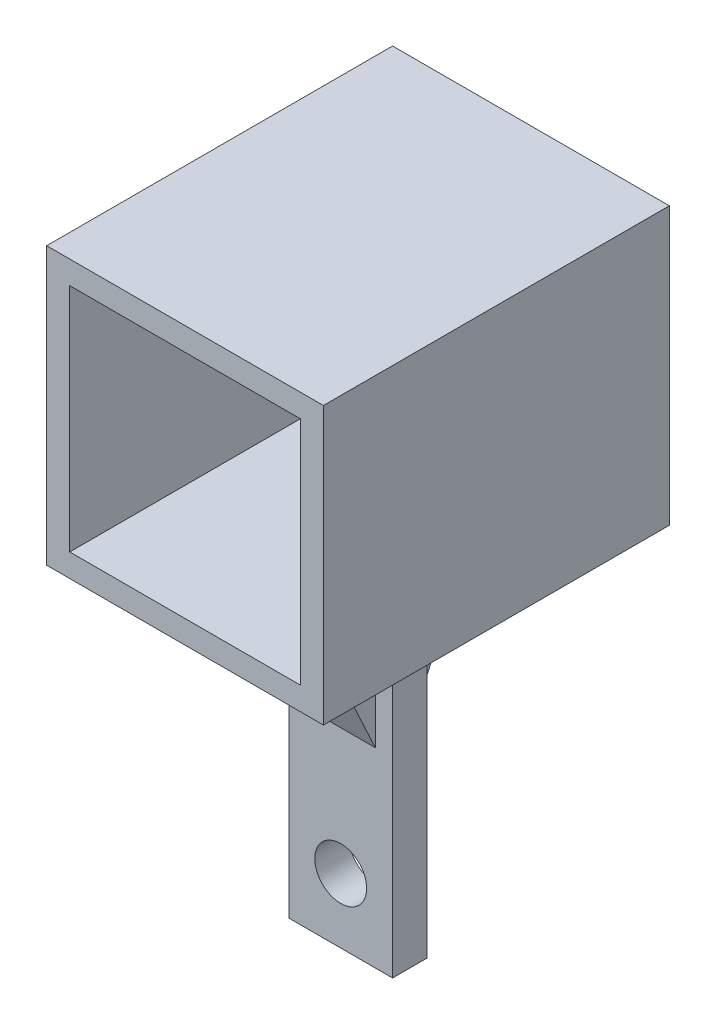
ISO-10303-21;
HEADER;
FILE_DESCRIPTION(('STEP AP214'),'2;1');
FILE_NAME('part.step','',(''),(''),'','','');
FILE_SCHEMA(('AUTOMOTIVE_DESIGN { 1 0 10303 214 1 1 1 1 }'));
ENDSEC;
DATA;
#1=APPLICATION_CONTEXT('core data for automotive mechanical design processes');
#2=APPLICATION_PROTOCOL_DEFINITION('international standard','automotive_design',2000,#1);
#3=PRODUCT_CONTEXT('',#1,'mechanical');
#4=PRODUCT('Part','Part','',(#3));
#5=PRODUCT_RELATED_PRODUCT_CATEGORY('part','',(#4));
#6=PRODUCT_DEFINITION_FORMATION('','',#4);
#7=PRODUCT_DEFINITION_CONTEXT('part definition',#1,'design');
#8=PRODUCT_DEFINITION('design','',#6,#7);
#9=PRODUCT_DEFINITION_SHAPE('','',#8);
#10=(LENGTH_UNIT() NAMED_UNIT(*) SI_UNIT(.MILLI.,.METRE.));
#11=(NAMED_UNIT(*) PLANE_ANGLE_UNIT() SI_UNIT($,.RADIAN.));
#12=(NAMED_UNIT(*) SI_UNIT($,.STERADIAN.) SOLID_ANGLE_UNIT());
#13=UNCERTAINTY_MEASURE_WITH_UNIT(LENGTH_MEASURE(1.E-05),#10,'distance_accuracy_value','');
#14=(GEOMETRIC_REPRESENTATION_CONTEXT(3) GLOBAL_UNCERTAINTY_ASSIGNED_CONTEXT((#13)) GLOBAL_UNIT_ASSIGNED_CONTEXT((#10,
#11,#12)) REPRESENTATION_CONTEXT('',''));
#15=CARTESIAN_POINT('',(0.,0.,0.));
#16=DIRECTION('',(0.,0.,1.));
#17=DIRECTION('',(1.,0.,0.));
#18=AXIS2_PLACEMENT_3D('',#15,#16,#17);
#19=CARTESIAN_POINT('',(0.,0.,1.5));
#20=DIRECTION('',(0.,0.,-1.));
#21=DIRECTION('',(-1.,0.,0.));
#22=AXIS2_PLACEMENT_3D('',#19,#20,#21);
#23=PLANE('',#22);
#24=CARTESIAN_POINT('',(0.,0.,1.5));
#25=DIRECTION('',(0.,0.,1.));
#26=DIRECTION('',(1.,0.,0.));
#27=AXIS2_PLACEMENT_3D('',#24,#25,#26);
#28=CIRCLE('',#27,2.25);
#29=CARTESIAN_POINT('',(2.25,0.,1.5));
#30=VERTEX_POINT('',#29);
#31=EDGE_CURVE('E270',#30,#30,#28,.T.);
#32=ORIENTED_EDGE('',*,*,#31,.F.);
#33=EDGE_LOOP('',(#32));
#34=FACE_BOUND('',#33,.T.);
#35=DIRECTION('',(0.,1.,0.));
#36=VECTOR('',#35,1.);
#37=CARTESIAN_POINT('',(3.,10.95,1.5));
#38=LINE('',#37,#36);
#39=CARTESIAN_POINT('',(3.,10.95,1.5));
#40=VERTEX_POINT('',#39);
#41=CARTESIAN_POINT('',(3.,23.9,1.5));
#42=VERTEX_POINT('',#41);
#43=EDGE_CURVE('E163',#40,#42,#38,.T.);
#44=ORIENTED_EDGE('',*,*,#43,.F.);
#45=DIRECTION('',(-1.,0.,0.));
#46=VECTOR('',#45,1.);
#47=CARTESIAN_POINT('',(3.,10.95,1.5));
#48=LINE('',#47,#46);
#49=CARTESIAN_POINT('',(-3.,10.95,1.5));
#50=VERTEX_POINT('',#49);
#51=EDGE_CURVE('E160',#40,#50,#48,.T.);
#52=ORIENTED_EDGE('',*,*,#51,.T.);
#53=DIRECTION('',(0.,1.,0.));
#54=VECTOR('',#53,1.);
#55=CARTESIAN_POINT('',(-3.,10.95,1.5));
#56=LINE('',#55,#54);
#57=CARTESIAN_POINT('',(-3.,23.9,1.5));
#58=VERTEX_POINT('',#57);
#59=EDGE_CURVE('E170',#50,#58,#56,.T.);
#60=ORIENTED_EDGE('',*,*,#59,.T.);
#61=DIRECTION('',(1.,0.,0.));
#62=VECTOR('',#61,1.);
#63=CARTESIAN_POINT('',(0.,23.9,1.5));
#64=LINE('',#63,#62);
#65=CARTESIAN_POINT('',(-4.5,23.9,1.5));
#66=VERTEX_POINT('',#65);
#67=EDGE_CURVE('E264',#66,#58,#64,.T.);
#68=ORIENTED_EDGE('',*,*,#67,.F.);
#69=DIRECTION('',(0.,-1.,0.));
#70=VECTOR('',#69,1.);
#71=CARTESIAN_POINT('',(-4.5,-5.6,1.5));
#72=LINE('',#71,#70);
#73=CARTESIAN_POINT('',(-4.5,-5.6,1.5));
#74=VERTEX_POINT('',#73);
#75=EDGE_CURVE('E276',#66,#74,#72,.T.);
#76=ORIENTED_EDGE('',*,*,#75,.T.);
#77=DIRECTION('',(1.,0.,0.));
#78=VECTOR('',#77,1.);
#79=CARTESIAN_POINT('',(-4.5,-5.6,1.5));
#80=LINE('',#79,#78);
#81=CARTESIAN_POINT('',(4.5,-5.6,1.5));
#82=VERTEX_POINT('',#81);
#83=EDGE_CURVE('E278',#74,#82,#80,.T.);
#84=ORIENTED_EDGE('',*,*,#83,.T.);
#85=DIRECTION('',(0.,1.,0.));
#86=VECTOR('',#85,1.);
#87=CARTESIAN_POINT('',(4.5,-5.6,1.5));
#88=LINE('',#87,#86);
#89=CARTESIAN_POINT('',(4.5,23.9,1.5));
#90=VERTEX_POINT('',#89);
#91=EDGE_CURVE('E281',#82,#90,#88,.T.);
#92=ORIENTED_EDGE('',*,*,#91,.T.);
#93=EDGE_CURVE('E263',#42,#90,#64,.T.);
#94=ORIENTED_EDGE('',*,*,#93,.F.);
#95=EDGE_LOOP('',(#44,#52,#60,#68,#76,#84,#92,#94));
#96=FACE_BOUND('',#95,.T.);
#97=ADVANCED_FACE('F33',(#34,#96),#23,.F.);
#98=CARTESIAN_POINT('',(-12.,23.9,15.));
#99=DIRECTION('',(0.,1.,0.));
#100=DIRECTION('',(0.,0.,1.));
#101=AXIS2_PLACEMENT_3D('',#98,#99,#100);
#102=PLANE('',#101);
#103=DIRECTION('',(1.,0.,0.));
#104=VECTOR('',#103,1.);
#105=CARTESIAN_POINT('',(-12.,23.9,-15.));
#106=LINE('',#105,#104);
#107=CARTESIAN_POINT('',(-12.,23.9,-15.));
#108=VERTEX_POINT('',#107);
#109=CARTESIAN_POINT('',(12.,23.9,-15.));
#110=VERTEX_POINT('',#109);
#111=EDGE_CURVE('E234',#108,#110,#106,.T.);
#112=ORIENTED_EDGE('',*,*,#111,.T.);
#113=DIRECTION('',(0.,0.,-1.));
#114=VECTOR('',#113,1.);
#115=CARTESIAN_POINT('',(12.,23.9,15.));
#116=LINE('',#115,#114);
#117=CARTESIAN_POINT('',(12.,23.9,15.));
#118=VERTEX_POINT('',#117);
#119=EDGE_CURVE('E240',#118,#110,#116,.T.);
#120=ORIENTED_EDGE('',*,*,#119,.F.);
#121=DIRECTION('',(1.,0.,0.));
#122=VECTOR('',#121,1.);
#123=CARTESIAN_POINT('',(-12.,23.9,15.));
#124=LINE('',#123,#122);
#125=CARTESIAN_POINT('',(-12.,23.9,15.));
#126=VERTEX_POINT('',#125);
#127=EDGE_CURVE('E238',#126,#118,#124,.T.);
#128=ORIENTED_EDGE('',*,*,#127,.F.);
#129=DIRECTION('',(0.,0.,-1.));
#130=VECTOR('',#129,1.);
#131=CARTESIAN_POINT('',(-12.,23.9,15.));
#132=LINE('',#131,#130);
#133=EDGE_CURVE('E250',#126,#108,#132,.T.);
#134=ORIENTED_EDGE('',*,*,#133,.T.);
#135=EDGE_LOOP('',(#112,#120,#128,#134));
#136=FACE_BOUND('',#135,.T.);
#137=DIRECTION('',(0.,0.,1.));
#138=VECTOR('',#137,1.);
#139=CARTESIAN_POINT('',(3.,23.9,1.5));
#140=LINE('',#139,#138);
#141=CARTESIAN_POINT('',(3.,23.9,7.5));
#142=VERTEX_POINT('',#141);
#143=EDGE_CURVE('E164',#42,#142,#140,.T.);
#144=ORIENTED_EDGE('',*,*,#143,.F.);
#145=ORIENTED_EDGE('',*,*,#93,.T.);
#146=DIRECTION('',(0.,0.,-1.));
#147=VECTOR('',#146,1.);
#148=CARTESIAN_POINT('',(4.5,23.9,1.5));
#149=LINE('',#148,#147);
#150=CARTESIAN_POINT('',(4.5,23.9,-1.5));
#151=VERTEX_POINT('',#150);
#152=EDGE_CURVE('E11',#90,#151,#149,.T.);
#153=ORIENTED_EDGE('',*,*,#152,.T.);
#154=DIRECTION('',(1.,0.,0.));
#155=VECTOR('',#154,1.);
#156=CARTESIAN_POINT('',(0.,23.9,-1.5));
#157=LINE('',#156,#155);
#158=CARTESIAN_POINT('',(3.,23.9,-1.5));
#159=VERTEX_POINT('',#158);
#160=EDGE_CURVE('E259',#159,#151,#157,.T.);
#161=ORIENTED_EDGE('',*,*,#160,.F.);
#162=DIRECTION('',(0.,0.,1.));
#163=VECTOR('',#162,1.);
#164=CARTESIAN_POINT('',(3.,23.9,-1.5));
#165=LINE('',#164,#163);
#166=CARTESIAN_POINT('',(3.,23.9,-7.5));
#167=VERTEX_POINT('',#166);
#168=EDGE_CURVE('E183',#167,#159,#165,.T.);
#169=ORIENTED_EDGE('',*,*,#168,.F.);
#170=DIRECTION('',(-1.,0.,0.));
#171=VECTOR('',#170,1.);
#172=CARTESIAN_POINT('',(3.,23.9,-7.5));
#173=LINE('',#172,#171);
#174=CARTESIAN_POINT('',(-3.,23.9,-7.5));
#175=VERTEX_POINT('',#174);
#176=EDGE_CURVE('E191',#167,#175,#173,.T.);
#177=ORIENTED_EDGE('',*,*,#176,.T.);
#178=DIRECTION('',(0.,0.,1.));
#179=VECTOR('',#178,1.);
#180=CARTESIAN_POINT('',(-3.,23.9,-1.5));
#181=LINE('',#180,#179);
#182=CARTESIAN_POINT('',(-3.,23.9,-1.5));
#183=VERTEX_POINT('',#182);
#184=EDGE_CURVE('E176',#175,#183,#181,.T.);
#185=ORIENTED_EDGE('',*,*,#184,.T.);
#186=CARTESIAN_POINT('',(-4.5,23.9,-1.5));
#187=VERTEX_POINT('',#186);
#188=EDGE_CURVE('E260',#187,#183,#157,.T.);
#189=ORIENTED_EDGE('',*,*,#188,.F.);
#190=DIRECTION('',(0.,0.,1.));
#191=VECTOR('',#190,1.);
#192=CARTESIAN_POINT('',(-4.5,23.9,1.5));
#193=LINE('',#192,#191);
#194=EDGE_CURVE('E266',#187,#66,#193,.T.);
#195=ORIENTED_EDGE('',*,*,#194,.T.);
#196=ORIENTED_EDGE('',*,*,#67,.T.);
#197=DIRECTION('',(0.,0.,1.));
#198=VECTOR('',#197,1.);
#199=CARTESIAN_POINT('',(-3.,23.9,1.5));
#200=LINE('',#199,#198);
#201=CARTESIAN_POINT('',(-3.,23.9,7.5));
#202=VERTEX_POINT('',#201);
#203=EDGE_CURVE('E175',#58,#202,#200,.T.);
#204=ORIENTED_EDGE('',*,*,#203,.T.);
#205=DIRECTION('',(-1.,0.,0.));
#206=VECTOR('',#205,1.);
#207=CARTESIAN_POINT('',(3.,23.9,7.5));
#208=LINE('',#207,#206);
#209=EDGE_CURVE('E48',#142,#202,#208,.T.);
#210=ORIENTED_EDGE('',*,*,#209,.F.);
#211=EDGE_LOOP('',(#144,#145,#153,#161,#169,#177,#185,#189,#195,#196,#204,#210));
#212=FACE_BOUND('',#211,.T.);
#213=ADVANCED_FACE('F173',(#136,#212),#102,.F.);
#214=CARTESIAN_POINT('',(0.,0.,-1.5));
#215=DIRECTION('',(0.,0.,-1.));
#216=DIRECTION('',(-1.,0.,0.));
#217=AXIS2_PLACEMENT_3D('',#214,#215,#216);
#218=PLANE('',#217);
#219=DIRECTION('',(0.,-1.,0.));
#220=VECTOR('',#219,1.);
#221=CARTESIAN_POINT('',(3.,10.95,-1.5));
#222=LINE('',#221,#220);
#223=CARTESIAN_POINT('',(3.,10.95,-1.5));
#224=VERTEX_POINT('',#223);
#225=EDGE_CURVE('E186',#159,#224,#222,.T.);
#226=ORIENTED_EDGE('',*,*,#225,.F.);
#227=ORIENTED_EDGE('',*,*,#160,.T.);
#228=DIRECTION('',(0.,1.,0.));
#229=VECTOR('',#228,1.);
#230=CARTESIAN_POINT('',(4.5,-5.6,-1.5));
#231=LINE('',#230,#229);
#232=CARTESIAN_POINT('',(4.5,-5.6,-1.5));
#233=VERTEX_POINT('',#232);
#234=EDGE_CURVE('E279',#233,#151,#231,.T.);
#235=ORIENTED_EDGE('',*,*,#234,.F.);
#236=DIRECTION('',(1.,0.,0.));
#237=VECTOR('',#236,1.);
#238=CARTESIAN_POINT('',(-4.5,-5.6,-1.5));
#239=LINE('',#238,#237);
#240=CARTESIAN_POINT('',(-4.5,-5.6,-1.5));
#241=VERTEX_POINT('',#240);
#242=EDGE_CURVE('E286',#241,#233,#239,.T.);
#243=ORIENTED_EDGE('',*,*,#242,.F.);
#244=DIRECTION('',(0.,-1.,0.));
#245=VECTOR('',#244,1.);
#246=CARTESIAN_POINT('',(-4.5,-5.6,-1.5));
#247=LINE('',#246,#245);
#248=EDGE_CURVE('E273',#187,#241,#247,.T.);
#249=ORIENTED_EDGE('',*,*,#248,.F.);
#250=ORIENTED_EDGE('',*,*,#188,.T.);
#251=DIRECTION('',(0.,-1.,0.));
#252=VECTOR('',#251,1.);
#253=CARTESIAN_POINT('',(-3.,10.95,-1.5));
#254=LINE('',#253,#252);
#255=CARTESIAN_POINT('',(-3.,10.95,-1.5));
#256=VERTEX_POINT('',#255);
#257=EDGE_CURVE('E178',#183,#256,#254,.T.);
#258=ORIENTED_EDGE('',*,*,#257,.T.);
#259=DIRECTION('',(-1.,0.,0.));
#260=VECTOR('',#259,1.);
#261=CARTESIAN_POINT('',(3.,10.95,-1.5));
#262=LINE('',#261,#260);
#263=EDGE_CURVE('E56',#224,#256,#262,.T.);
#264=ORIENTED_EDGE('',*,*,#263,.F.);
#265=EDGE_LOOP('',(#226,#227,#235,#243,#249,#250,#258,#264));
#266=FACE_BOUND('',#265,.T.);
#267=CARTESIAN_POINT('',(0.,0.,-1.5));
#268=DIRECTION('',(0.,0.,1.));
#269=DIRECTION('',(1.,0.,0.));
#270=AXIS2_PLACEMENT_3D('',#267,#268,#269);
#271=CIRCLE('',#270,2.25);
#272=CARTESIAN_POINT('',(2.25,0.,-1.5));
#273=VERTEX_POINT('',#272);
#274=EDGE_CURVE('E269',#273,#273,#271,.T.);
#275=ORIENTED_EDGE('',*,*,#274,.T.);
#276=EDGE_LOOP('',(#275));
#277=FACE_BOUND('',#276,.T.);
#278=ADVANCED_FACE('F303',(#266,#277),#218,.T.);
#279=CARTESIAN_POINT('',(-4.5,-5.6,1.5));
#280=DIRECTION('',(1.,0.,0.));
#281=DIRECTION('',(0.,0.,-1.));
#282=AXIS2_PLACEMENT_3D('',#279,#280,#281);
#283=PLANE('',#282);
#284=ORIENTED_EDGE('',*,*,#194,.F.);
#285=ORIENTED_EDGE('',*,*,#248,.T.);
#286=DIRECTION('',(0.,0.,-1.));
#287=VECTOR('',#286,1.);
#288=CARTESIAN_POINT('',(-4.5,-5.6,1.5));
#289=LINE('',#288,#287);
#290=EDGE_CURVE('E41',#74,#241,#289,.T.);
#291=ORIENTED_EDGE('',*,*,#290,.F.);
#292=ORIENTED_EDGE('',*,*,#75,.F.);
#293=EDGE_LOOP('',(#284,#285,#291,#292));
#294=FACE_BOUND('',#293,.T.);
#295=ADVANCED_FACE('F35',(#294),#283,.F.);
#296=CARTESIAN_POINT('',(4.5,-5.6,1.5));
#297=DIRECTION('',(-1.,0.,0.));
#298=DIRECTION('',(0.,-1.,0.));
#299=AXIS2_PLACEMENT_3D('',#296,#297,#298);
#300=PLANE('',#299);
#301=ORIENTED_EDGE('',*,*,#152,.F.);
#302=ORIENTED_EDGE('',*,*,#91,.F.);
#303=DIRECTION('',(0.,0.,-1.));
#304=VECTOR('',#303,1.);
#305=CARTESIAN_POINT('',(4.5,-5.6,1.5));
#306=LINE('',#305,#304);
#307=EDGE_CURVE('E284',#82,#233,#306,.T.);
#308=ORIENTED_EDGE('',*,*,#307,.T.);
#309=ORIENTED_EDGE('',*,*,#234,.T.);
#310=EDGE_LOOP('',(#301,#302,#308,#309));
#311=FACE_BOUND('',#310,.T.);
#312=ADVANCED_FACE('F308',(#311),#300,.F.);
#313=CARTESIAN_POINT('',(-4.5,-5.6,1.5));
#314=DIRECTION('',(0.,1.,0.));
#315=DIRECTION('',(0.,0.,1.));
#316=AXIS2_PLACEMENT_3D('',#313,#314,#315);
#317=PLANE('',#316);
#318=ORIENTED_EDGE('',*,*,#242,.T.);
#319=ORIENTED_EDGE('',*,*,#307,.F.);
#320=ORIENTED_EDGE('',*,*,#83,.F.);
#321=ORIENTED_EDGE('',*,*,#290,.T.);
#322=EDGE_LOOP('',(#318,#319,#320,#321));
#323=FACE_BOUND('',#322,.T.);
#324=ADVANCED_FACE('F295',(#323),#317,.F.);
#325=CARTESIAN_POINT('',(0.,0.,1.5));
#326=DIRECTION('',(0.,0.,-1.));
#327=DIRECTION('',(-1.,0.,0.));
#328=AXIS2_PLACEMENT_3D('',#325,#326,#327);
#329=CYLINDRICAL_SURFACE('',#328,2.25);
#330=ORIENTED_EDGE('',*,*,#31,.T.);
#331=EDGE_LOOP('',(#330));
#332=FACE_BOUND('',#331,.T.);
#333=ORIENTED_EDGE('',*,*,#274,.F.);
#334=EDGE_LOOP('',(#333));
#335=FACE_BOUND('',#334,.T.);
#336=ADVANCED_FACE('F345',(#332,#335),#329,.F.);
#337=CARTESIAN_POINT('',(0.,0.,15.));
#338=DIRECTION('',(0.,0.,-1.));
#339=DIRECTION('',(-1.,0.,0.));
#340=AXIS2_PLACEMENT_3D('',#337,#338,#339);
#341=PLANE('',#340);
#342=DIRECTION('',(0.,1.,0.));
#343=VECTOR('',#342,1.);
#344=CARTESIAN_POINT('',(12.,23.9,15.));
#345=LINE('',#344,#343);
#346=CARTESIAN_POINT('',(12.,47.9,15.));
#347=VERTEX_POINT('',#346);
#348=EDGE_CURVE('E230',#118,#347,#345,.T.);
#349=ORIENTED_EDGE('',*,*,#348,.T.);
#350=DIRECTION('',(-1.,0.,0.));
#351=VECTOR('',#350,1.);
#352=CARTESIAN_POINT('',(-12.,47.9,15.));
#353=LINE('',#352,#351);
#354=CARTESIAN_POINT('',(-12.,47.9,15.));
#355=VERTEX_POINT('',#354);
#356=EDGE_CURVE('E233',#347,#355,#353,.T.);
#357=ORIENTED_EDGE('',*,*,#356,.T.);
#358=DIRECTION('',(0.,-1.,0.));
#359=VECTOR('',#358,1.);
#360=CARTESIAN_POINT('',(-12.,23.9,15.));
#361=LINE('',#360,#359);
#362=EDGE_CURVE('E236',#355,#126,#361,.T.);
#363=ORIENTED_EDGE('',*,*,#362,.T.);
#364=ORIENTED_EDGE('',*,*,#127,.T.);
#365=EDGE_LOOP('',(#349,#357,#363,#364));
#366=FACE_BOUND('',#365,.T.);
#367=DIRECTION('',(0.,1.,0.));
#368=VECTOR('',#367,1.);
#369=CARTESIAN_POINT('',(10.,25.9,15.));
#370=LINE('',#369,#368);
#371=CARTESIAN_POINT('',(10.,25.9,15.));
#372=VERTEX_POINT('',#371);
#373=CARTESIAN_POINT('',(10.,45.9,15.));
#374=VERTEX_POINT('',#373);
#375=EDGE_CURVE('E199',#372,#374,#370,.T.);
#376=ORIENTED_EDGE('',*,*,#375,.F.);
#377=DIRECTION('',(1.,0.,0.));
#378=VECTOR('',#377,1.);
#379=CARTESIAN_POINT('',(-10.,25.9,15.));
#380=LINE('',#379,#378);
#381=CARTESIAN_POINT('',(-10.,25.9,15.));
#382=VERTEX_POINT('',#381);
#383=EDGE_CURVE('E207',#382,#372,#380,.T.);
#384=ORIENTED_EDGE('',*,*,#383,.F.);
#385=DIRECTION('',(0.,-1.,0.));
#386=VECTOR('',#385,1.);
#387=CARTESIAN_POINT('',(-10.,25.9,15.));
#388=LINE('',#387,#386);
#389=CARTESIAN_POINT('',(-10.,45.9,15.));
#390=VERTEX_POINT('',#389);
#391=EDGE_CURVE('E204',#390,#382,#388,.T.);
#392=ORIENTED_EDGE('',*,*,#391,.F.);
#393=DIRECTION('',(-1.,0.,0.));
#394=VECTOR('',#393,1.);
#395=CARTESIAN_POINT('',(-10.,45.9,15.));
#396=LINE('',#395,#394);
#397=EDGE_CURVE('E201',#374,#390,#396,.T.);
#398=ORIENTED_EDGE('',*,*,#397,.F.);
#399=EDGE_LOOP('',(#376,#384,#392,#398));
#400=FACE_BOUND('',#399,.T.);
#401=ADVANCED_FACE('F358',(#366,#400),#341,.F.);
#402=CARTESIAN_POINT('',(0.,0.,-15.));
#403=DIRECTION('',(0.,0.,-1.));
#404=DIRECTION('',(-1.,0.,0.));
#405=AXIS2_PLACEMENT_3D('',#402,#403,#404);
#406=PLANE('',#405);
#407=DIRECTION('',(0.,1.,0.));
#408=VECTOR('',#407,1.);
#409=CARTESIAN_POINT('',(12.,23.9,-15.));
#410=LINE('',#409,#408);
#411=CARTESIAN_POINT('',(12.,47.9,-15.));
#412=VERTEX_POINT('',#411);
#413=EDGE_CURVE('E229',#110,#412,#410,.T.);
#414=ORIENTED_EDGE('',*,*,#413,.F.);
#415=ORIENTED_EDGE('',*,*,#111,.F.);
#416=DIRECTION('',(0.,-1.,0.));
#417=VECTOR('',#416,1.);
#418=CARTESIAN_POINT('',(-12.,23.9,-15.));
#419=LINE('',#418,#417);
#420=CARTESIAN_POINT('',(-12.,47.9,-15.));
#421=VERTEX_POINT('',#420);
#422=EDGE_CURVE('E245',#421,#108,#419,.T.);
#423=ORIENTED_EDGE('',*,*,#422,.F.);
#424=DIRECTION('',(-1.,0.,0.));
#425=VECTOR('',#424,1.);
#426=CARTESIAN_POINT('',(-12.,47.9,-15.));
#427=LINE('',#426,#425);
#428=EDGE_CURVE('E243',#412,#421,#427,.T.);
#429=ORIENTED_EDGE('',*,*,#428,.F.);
#430=EDGE_LOOP('',(#414,#415,#423,#429));
#431=FACE_BOUND('',#430,.T.);
#432=DIRECTION('',(1.,0.,0.));
#433=VECTOR('',#432,1.);
#434=CARTESIAN_POINT('',(-10.,25.9,-15.));
#435=LINE('',#434,#433);
#436=CARTESIAN_POINT('',(-10.,25.9,-15.));
#437=VERTEX_POINT('',#436);
#438=CARTESIAN_POINT('',(10.,25.9,-15.));
#439=VERTEX_POINT('',#438);
#440=EDGE_CURVE('E202',#437,#439,#435,.T.);
#441=ORIENTED_EDGE('',*,*,#440,.T.);
#442=DIRECTION('',(0.,1.,0.));
#443=VECTOR('',#442,1.);
#444=CARTESIAN_POINT('',(10.,25.9,-15.));
#445=LINE('',#444,#443);
#446=CARTESIAN_POINT('',(10.,45.9,-15.));
#447=VERTEX_POINT('',#446);
#448=EDGE_CURVE('E198',#439,#447,#445,.T.);
#449=ORIENTED_EDGE('',*,*,#448,.T.);
#450=DIRECTION('',(-1.,0.,0.));
#451=VECTOR('',#450,1.);
#452=CARTESIAN_POINT('',(-10.,45.9,-15.));
#453=LINE('',#452,#451);
#454=CARTESIAN_POINT('',(-10.,45.9,-15.));
#455=VERTEX_POINT('',#454);
#456=EDGE_CURVE('E212',#447,#455,#453,.T.);
#457=ORIENTED_EDGE('',*,*,#456,.T.);
#458=DIRECTION('',(0.,-1.,0.));
#459=VECTOR('',#458,1.);
#460=CARTESIAN_POINT('',(-10.,25.9,-15.));
#461=LINE('',#460,#459);
#462=EDGE_CURVE('E215',#455,#437,#461,.T.);
#463=ORIENTED_EDGE('',*,*,#462,.T.);
#464=EDGE_LOOP('',(#441,#449,#457,#463));
#465=FACE_BOUND('',#464,.T.);
#466=ADVANCED_FACE('F363',(#431,#465),#406,.T.);
#467=CARTESIAN_POINT('',(12.,23.9,15.));
#468=DIRECTION('',(-1.,0.,0.));
#469=DIRECTION('',(0.,0.,1.));
#470=AXIS2_PLACEMENT_3D('',#467,#468,#469);
#471=PLANE('',#470);
#472=ORIENTED_EDGE('',*,*,#413,.T.);
#473=DIRECTION('',(0.,0.,-1.));
#474=VECTOR('',#473,1.);
#475=CARTESIAN_POINT('',(12.,47.9,15.));
#476=LINE('',#475,#474);
#477=EDGE_CURVE('E256',#347,#412,#476,.T.);
#478=ORIENTED_EDGE('',*,*,#477,.F.);
#479=ORIENTED_EDGE('',*,*,#348,.F.);
#480=ORIENTED_EDGE('',*,*,#119,.T.);
#481=EDGE_LOOP('',(#472,#478,#479,#480));
#482=FACE_BOUND('',#481,.T.);
#483=ADVANCED_FACE('F371',(#482),#471,.F.);
#484=CARTESIAN_POINT('',(-12.,47.9,15.));
#485=DIRECTION('',(0.,-1.,0.));
#486=DIRECTION('',(0.,0.,-1.));
#487=AXIS2_PLACEMENT_3D('',#484,#485,#486);
#488=PLANE('',#487);
#489=ORIENTED_EDGE('',*,*,#428,.T.);
#490=DIRECTION('',(0.,0.,-1.));
#491=VECTOR('',#490,1.);
#492=CARTESIAN_POINT('',(-12.,47.9,15.));
#493=LINE('',#492,#491);
#494=EDGE_CURVE('E253',#355,#421,#493,.T.);
#495=ORIENTED_EDGE('',*,*,#494,.F.);
#496=ORIENTED_EDGE('',*,*,#356,.F.);
#497=ORIENTED_EDGE('',*,*,#477,.T.);
#498=EDGE_LOOP('',(#489,#495,#496,#497));
#499=FACE_BOUND('',#498,.T.);
#500=ADVANCED_FACE('F382',(#499),#488,.F.);
#501=CARTESIAN_POINT('',(-12.,23.9,15.));
#502=DIRECTION('',(1.,0.,0.));
#503=DIRECTION('',(0.,0.,-1.));
#504=AXIS2_PLACEMENT_3D('',#501,#502,#503);
#505=PLANE('',#504);
#506=ORIENTED_EDGE('',*,*,#422,.T.);
#507=ORIENTED_EDGE('',*,*,#133,.F.);
#508=ORIENTED_EDGE('',*,*,#362,.F.);
#509=ORIENTED_EDGE('',*,*,#494,.T.);
#510=EDGE_LOOP('',(#506,#507,#508,#509));
#511=FACE_BOUND('',#510,.T.);
#512=ADVANCED_FACE('F379',(#511),#505,.F.);
#513=CARTESIAN_POINT('',(10.,25.9,15.));
#514=DIRECTION('',(-1.,0.,0.));
#515=DIRECTION('',(0.,0.,1.));
#516=AXIS2_PLACEMENT_3D('',#513,#514,#515);
#517=PLANE('',#516);
#518=ORIENTED_EDGE('',*,*,#448,.F.);
#519=DIRECTION('',(0.,0.,-1.));
#520=VECTOR('',#519,1.);
#521=CARTESIAN_POINT('',(10.,25.9,15.));
#522=LINE('',#521,#520);
#523=EDGE_CURVE('E209',#372,#439,#522,.T.);
#524=ORIENTED_EDGE('',*,*,#523,.F.);
#525=ORIENTED_EDGE('',*,*,#375,.T.);
#526=DIRECTION('',(0.,0.,-1.));
#527=VECTOR('',#526,1.);
#528=CARTESIAN_POINT('',(10.,45.9,15.));
#529=LINE('',#528,#527);
#530=EDGE_CURVE('E226',#374,#447,#529,.T.);
#531=ORIENTED_EDGE('',*,*,#530,.T.);
#532=EDGE_LOOP('',(#518,#524,#525,#531));
#533=FACE_BOUND('',#532,.T.);
#534=ADVANCED_FACE('F376',(#533),#517,.T.);
#535=CARTESIAN_POINT('',(-10.,45.9,15.));
#536=DIRECTION('',(0.,-1.,0.));
#537=DIRECTION('',(0.,0.,-1.));
#538=AXIS2_PLACEMENT_3D('',#535,#536,#537);
#539=PLANE('',#538);
#540=ORIENTED_EDGE('',*,*,#456,.F.);
#541=ORIENTED_EDGE('',*,*,#530,.F.);
#542=ORIENTED_EDGE('',*,*,#397,.T.);
#543=DIRECTION('',(0.,0.,-1.));
#544=VECTOR('',#543,1.);
#545=CARTESIAN_POINT('',(-10.,45.9,15.));
#546=LINE('',#545,#544);
#547=EDGE_CURVE('E224',#390,#455,#546,.T.);
#548=ORIENTED_EDGE('',*,*,#547,.T.);
#549=EDGE_LOOP('',(#540,#541,#542,#548));
#550=FACE_BOUND('',#549,.T.);
#551=ADVANCED_FACE('F412',(#550),#539,.T.);
#552=CARTESIAN_POINT('',(-10.,25.9,15.));
#553=DIRECTION('',(1.,0.,0.));
#554=DIRECTION('',(0.,0.,-1.));
#555=AXIS2_PLACEMENT_3D('',#552,#553,#554);
#556=PLANE('',#555);
#557=ORIENTED_EDGE('',*,*,#462,.F.);
#558=ORIENTED_EDGE('',*,*,#547,.F.);
#559=ORIENTED_EDGE('',*,*,#391,.T.);
#560=DIRECTION('',(0.,0.,-1.));
#561=VECTOR('',#560,1.);
#562=CARTESIAN_POINT('',(-10.,25.9,15.));
#563=LINE('',#562,#561);
#564=EDGE_CURVE('E222',#382,#437,#563,.T.);
#565=ORIENTED_EDGE('',*,*,#564,.T.);
#566=EDGE_LOOP('',(#557,#558,#559,#565));
#567=FACE_BOUND('',#566,.T.);
#568=ADVANCED_FACE('F351',(#567),#556,.T.);
#569=CARTESIAN_POINT('',(-4.5,25.9,1.5));
#570=DIRECTION('',(0.,-1.,0.));
#571=DIRECTION('',(1.,0.,0.));
#572=AXIS2_PLACEMENT_3D('',#569,#570,#571);
#573=PLANE('',#572);
#574=ORIENTED_EDGE('',*,*,#440,.F.);
#575=ORIENTED_EDGE('',*,*,#564,.F.);
#576=ORIENTED_EDGE('',*,*,#383,.T.);
#577=ORIENTED_EDGE('',*,*,#523,.T.);
#578=EDGE_LOOP('',(#574,#575,#576,#577));
#579=FACE_BOUND('',#578,.T.);
#580=ADVANCED_FACE('F331',(#579),#573,.F.);
#581=CARTESIAN_POINT('',(3.,23.9,-7.5));
#582=DIRECTION('',(0.,0.420390671912406,0.907343200210943));
#583=DIRECTION('',(0.,-0.907343200210943,0.420390671912406));
#584=AXIS2_PLACEMENT_3D('',#581,#582,#583);
#585=PLANE('',#584);
#586=DIRECTION('',(0.,0.907343200210943,-0.420390671912406));
#587=VECTOR('',#586,1.);
#588=CARTESIAN_POINT('',(-3.,23.9,-7.5));
#589=LINE('',#588,#587);
#590=EDGE_CURVE('E187',#256,#175,#589,.T.);
#591=ORIENTED_EDGE('',*,*,#590,.T.);
#592=ORIENTED_EDGE('',*,*,#176,.F.);
#593=DIRECTION('',(0.,0.907343200210943,-0.420390671912406));
#594=VECTOR('',#593,1.);
#595=CARTESIAN_POINT('',(3.,23.9,-7.5));
#596=LINE('',#595,#594);
#597=EDGE_CURVE('E189',#224,#167,#596,.T.);
#598=ORIENTED_EDGE('',*,*,#597,.F.);
#599=ORIENTED_EDGE('',*,*,#263,.T.);
#600=EDGE_LOOP('',(#591,#592,#598,#599));
#601=FACE_BOUND('',#600,.T.);
#602=ADVANCED_FACE('F320',(#601),#585,.F.);
#603=CARTESIAN_POINT('',(3.,0.,0.));
#604=DIRECTION('',(1.,0.,0.));
#605=DIRECTION('',(0.,0.,-1.));
#606=AXIS2_PLACEMENT_3D('',#603,#604,#605);
#607=PLANE('',#606);
#608=ORIENTED_EDGE('',*,*,#168,.T.);
#609=ORIENTED_EDGE('',*,*,#225,.T.);
#610=ORIENTED_EDGE('',*,*,#597,.T.);
#611=EDGE_LOOP('',(#608,#609,#610));
#612=FACE_BOUND('',#611,.T.);
#613=ADVANCED_FACE('F323',(#612),#607,.T.);
#614=CARTESIAN_POINT('',(-3.,0.,0.));
#615=DIRECTION('',(1.,0.,0.));
#616=DIRECTION('',(0.,0.,-1.));
#617=AXIS2_PLACEMENT_3D('',#614,#615,#616);
#618=PLANE('',#617);
#619=ORIENTED_EDGE('',*,*,#184,.F.);
#620=ORIENTED_EDGE('',*,*,#590,.F.);
#621=ORIENTED_EDGE('',*,*,#257,.F.);
#622=EDGE_LOOP('',(#619,#620,#621));
#623=FACE_BOUND('',#622,.T.);
#624=ADVANCED_FACE('F317',(#623),#618,.F.);
#625=CARTESIAN_POINT('',(3.,23.9,7.5));
#626=DIRECTION('',(0.,0.420390671912406,-0.907343200210943));
#627=DIRECTION('',(0.,0.907343200210943,0.420390671912406));
#628=AXIS2_PLACEMENT_3D('',#625,#626,#627);
#629=PLANE('',#628);
#630=DIRECTION('',(0.,-0.907343200210943,-0.420390671912406));
#631=VECTOR('',#630,1.);
#632=CARTESIAN_POINT('',(-3.,23.9,7.5));
#633=LINE('',#632,#631);
#634=EDGE_CURVE('E534',#202,#50,#633,.T.);
#635=ORIENTED_EDGE('',*,*,#634,.T.);
#636=ORIENTED_EDGE('',*,*,#51,.F.);
#637=DIRECTION('',(0.,-0.907343200210943,-0.420390671912406));
#638=VECTOR('',#637,1.);
#639=CARTESIAN_POINT('',(3.,23.9,7.5));
#640=LINE('',#639,#638);
#641=EDGE_CURVE('E156',#142,#40,#640,.T.);
#642=ORIENTED_EDGE('',*,*,#641,.F.);
#643=ORIENTED_EDGE('',*,*,#209,.T.);
#644=EDGE_LOOP('',(#635,#636,#642,#643));
#645=FACE_BOUND('',#644,.T.);
#646=ADVANCED_FACE('F158',(#645),#629,.F.);
#647=CARTESIAN_POINT('',(3.,0.,0.));
#648=DIRECTION('',(-1.,0.,0.));
#649=DIRECTION('',(0.,0.,1.));
#650=AXIS2_PLACEMENT_3D('',#647,#648,#649);
#651=PLANE('',#650);
#652=ORIENTED_EDGE('',*,*,#143,.T.);
#653=ORIENTED_EDGE('',*,*,#641,.T.);
#654=ORIENTED_EDGE('',*,*,#43,.T.);
#655=EDGE_LOOP('',(#652,#653,#654));
#656=FACE_BOUND('',#655,.T.);
#657=ADVANCED_FACE('F167',(#656),#651,.F.);
#658=CARTESIAN_POINT('',(-3.,0.,0.));
#659=DIRECTION('',(-1.,0.,0.));
#660=DIRECTION('',(0.,0.,1.));
#661=AXIS2_PLACEMENT_3D('',#658,#659,#660);
#662=PLANE('',#661);
#663=ORIENTED_EDGE('',*,*,#203,.F.);
#664=ORIENTED_EDGE('',*,*,#59,.F.);
#665=ORIENTED_EDGE('',*,*,#634,.F.);
#666=EDGE_LOOP('',(#663,#664,#665));
#667=FACE_BOUND('',#666,.T.);
#668=ADVANCED_FACE('F520',(#667),#662,.T.);
#669=CLOSED_SHELL('',(#97,#213,#278,#295,#312,#324,#336,#401,#466,#483,#500,#512,#534,#551,#568,
#580,#602,#613,#624,#646,#657,#668));
#670=MANIFOLD_SOLID_BREP('B2',#669);
#671=ADVANCED_BREP_SHAPE_REPRESENTATION('',(#18,#670),#14);
#672=SHAPE_DEFINITION_REPRESENTATION(#9,#671);
ENDSEC;
END-ISO-10303-21;
